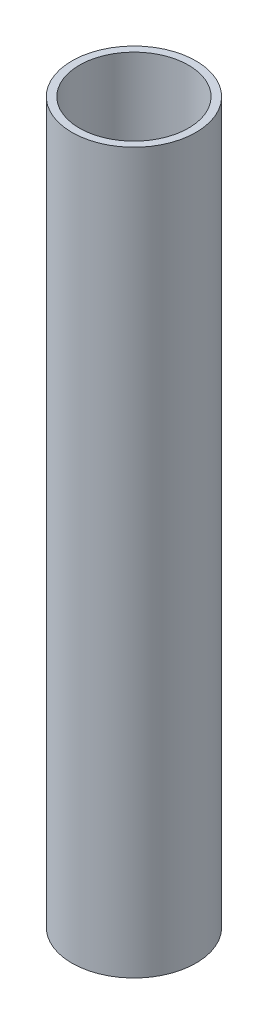
ISO-10303-21;
HEADER;
FILE_DESCRIPTION(('STEP AP214'),'2;1');
FILE_NAME('part.step','',(''),(''),'','','');
FILE_SCHEMA(('AUTOMOTIVE_DESIGN { 1 0 10303 214 1 1 1 1 }'));
ENDSEC;
DATA;
#1=APPLICATION_CONTEXT('core data for automotive mechanical design processes');
#2=APPLICATION_PROTOCOL_DEFINITION('international standard','automotive_design',2000,#1);
#3=PRODUCT_CONTEXT('',#1,'mechanical');
#4=PRODUCT('Part','Part','',(#3));
#5=PRODUCT_RELATED_PRODUCT_CATEGORY('part','',(#4));
#6=PRODUCT_DEFINITION_FORMATION('','',#4);
#7=PRODUCT_DEFINITION_CONTEXT('part definition',#1,'design');
#8=PRODUCT_DEFINITION('design','',#6,#7);
#9=PRODUCT_DEFINITION_SHAPE('','',#8);
#10=(LENGTH_UNIT() NAMED_UNIT(*) SI_UNIT(.MILLI.,.METRE.));
#11=(NAMED_UNIT(*) PLANE_ANGLE_UNIT() SI_UNIT($,.RADIAN.));
#12=(NAMED_UNIT(*) SI_UNIT($,.STERADIAN.) SOLID_ANGLE_UNIT());
#13=UNCERTAINTY_MEASURE_WITH_UNIT(LENGTH_MEASURE(1.E-05),#10,'distance_accuracy_value','');
#14=(GEOMETRIC_REPRESENTATION_CONTEXT(3) GLOBAL_UNCERTAINTY_ASSIGNED_CONTEXT((#13)) GLOBAL_UNIT_ASSIGNED_CONTEXT((#10,
#11,#12)) REPRESENTATION_CONTEXT('',''));
#15=CARTESIAN_POINT('',(0.,0.,0.));
#16=DIRECTION('',(0.,0.,1.));
#17=DIRECTION('',(1.,0.,0.));
#18=AXIS2_PLACEMENT_3D('',#15,#16,#17);
#19=CARTESIAN_POINT('',(0.,145.,0.));
#20=DIRECTION('',(0.,1.,0.));
#21=DIRECTION('',(0.,0.,1.));
#22=AXIS2_PLACEMENT_3D('',#19,#20,#21);
#23=PLANE('',#22);
#24=CARTESIAN_POINT('',(0.,145.,0.));
#25=DIRECTION('',(0.,1.,0.));
#26=DIRECTION('',(0.,0.,1.));
#27=AXIS2_PLACEMENT_3D('',#24,#25,#26);
#28=CIRCLE('',#27,12.5);
#29=CARTESIAN_POINT('',(0.,145.,12.5));
#30=VERTEX_POINT('',#29);
#31=EDGE_CURVE('E10',#30,#30,#28,.T.);
#32=ORIENTED_EDGE('',*,*,#31,.T.);
#33=EDGE_LOOP('',(#32));
#34=FACE_BOUND('',#33,.T.);
#35=CARTESIAN_POINT('',(0.,145.,0.));
#36=DIRECTION('',(0.,1.,0.));
#37=DIRECTION('',(0.,0.,1.));
#38=AXIS2_PLACEMENT_3D('',#35,#36,#37);
#39=CIRCLE('',#38,11.);
#40=CARTESIAN_POINT('',(0.,145.,11.));
#41=VERTEX_POINT('',#40);
#42=EDGE_CURVE('E44',#41,#41,#39,.T.);
#43=ORIENTED_EDGE('',*,*,#42,.F.);
#44=EDGE_LOOP('',(#43));
#45=FACE_BOUND('',#44,.T.);
#46=ADVANCED_FACE('F33',(#34,#45),#23,.T.);
#47=CARTESIAN_POINT('',(0.,0.,0.));
#48=DIRECTION('',(0.,1.,0.));
#49=DIRECTION('',(0.,0.,1.));
#50=AXIS2_PLACEMENT_3D('',#47,#48,#49);
#51=PLANE('',#50);
#52=CARTESIAN_POINT('',(0.,0.,0.));
#53=DIRECTION('',(0.,1.,0.));
#54=DIRECTION('',(0.,0.,1.));
#55=AXIS2_PLACEMENT_3D('',#52,#53,#54);
#56=CIRCLE('',#55,12.5);
#57=CARTESIAN_POINT('',(0.,0.,12.5));
#58=VERTEX_POINT('',#57);
#59=EDGE_CURVE('E37',#58,#58,#56,.T.);
#60=ORIENTED_EDGE('',*,*,#59,.F.);
#61=EDGE_LOOP('',(#60));
#62=FACE_BOUND('',#61,.T.);
#63=CARTESIAN_POINT('',(0.,0.,0.));
#64=DIRECTION('',(0.,1.,0.));
#65=DIRECTION('',(0.,0.,1.));
#66=AXIS2_PLACEMENT_3D('',#63,#64,#65);
#67=CIRCLE('',#66,11.);
#68=CARTESIAN_POINT('',(0.,0.,11.));
#69=VERTEX_POINT('',#68);
#70=EDGE_CURVE('E46',#69,#69,#67,.T.);
#71=ORIENTED_EDGE('',*,*,#70,.T.);
#72=EDGE_LOOP('',(#71));
#73=FACE_BOUND('',#72,.T.);
#74=ADVANCED_FACE('F56',(#62,#73),#51,.F.);
#75=CARTESIAN_POINT('',(0.,145.,0.));
#76=DIRECTION('',(0.,-1.,0.));
#77=DIRECTION('',(0.,0.,-1.));
#78=AXIS2_PLACEMENT_3D('',#75,#76,#77);
#79=CYLINDRICAL_SURFACE('',#78,12.5);
#80=ORIENTED_EDGE('',*,*,#31,.F.);
#81=EDGE_LOOP('',(#80));
#82=FACE_BOUND('',#81,.T.);
#83=ORIENTED_EDGE('',*,*,#59,.T.);
#84=EDGE_LOOP('',(#83));
#85=FACE_BOUND('',#84,.T.);
#86=ADVANCED_FACE('F35',(#82,#85),#79,.T.);
#87=CARTESIAN_POINT('',(0.,145.,0.));
#88=DIRECTION('',(0.,-1.,0.));
#89=DIRECTION('',(0.,0.,-1.));
#90=AXIS2_PLACEMENT_3D('',#87,#88,#89);
#91=CYLINDRICAL_SURFACE('',#90,11.);
#92=ORIENTED_EDGE('',*,*,#42,.T.);
#93=EDGE_LOOP('',(#92));
#94=FACE_BOUND('',#93,.T.);
#95=ORIENTED_EDGE('',*,*,#70,.F.);
#96=EDGE_LOOP('',(#95));
#97=FACE_BOUND('',#96,.T.);
#98=ADVANCED_FACE('F52',(#94,#97),#91,.F.);
#99=CLOSED_SHELL('',(#46,#74,#86,#98));
#100=MANIFOLD_SOLID_BREP('B2',#99);
#101=ADVANCED_BREP_SHAPE_REPRESENTATION('',(#18,#100),#14);
#102=SHAPE_DEFINITION_REPRESENTATION(#9,#101);
ENDSEC;
END-ISO-10303-21;
